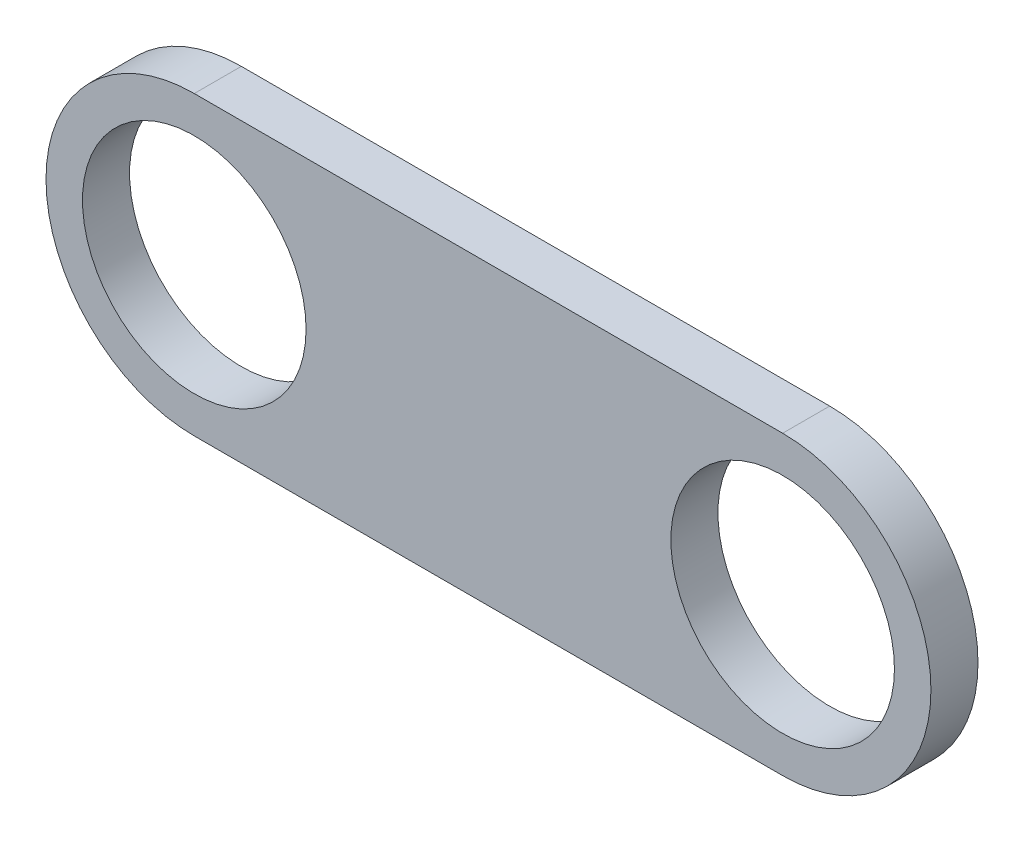
ISO-10303-21;
HEADER;
FILE_DESCRIPTION(('STEP AP214'),'2;1');
FILE_NAME('part.step','',(''),(''),'','','');
FILE_SCHEMA(('AUTOMOTIVE_DESIGN { 1 0 10303 214 1 1 1 1 }'));
ENDSEC;
DATA;
#1=APPLICATION_CONTEXT('core data for automotive mechanical design processes');
#2=APPLICATION_PROTOCOL_DEFINITION('international standard','automotive_design',2000,#1);
#3=PRODUCT_CONTEXT('',#1,'mechanical');
#4=PRODUCT('Part','Part','',(#3));
#5=PRODUCT_RELATED_PRODUCT_CATEGORY('part','',(#4));
#6=PRODUCT_DEFINITION_FORMATION('','',#4);
#7=PRODUCT_DEFINITION_CONTEXT('part definition',#1,'design');
#8=PRODUCT_DEFINITION('design','',#6,#7);
#9=PRODUCT_DEFINITION_SHAPE('','',#8);
#10=(LENGTH_UNIT() NAMED_UNIT(*) SI_UNIT(.MILLI.,.METRE.));
#11=(NAMED_UNIT(*) PLANE_ANGLE_UNIT() SI_UNIT($,.RADIAN.));
#12=(NAMED_UNIT(*) SI_UNIT($,.STERADIAN.) SOLID_ANGLE_UNIT());
#13=UNCERTAINTY_MEASURE_WITH_UNIT(LENGTH_MEASURE(1.E-05),#10,'distance_accuracy_value','');
#14=(GEOMETRIC_REPRESENTATION_CONTEXT(3) GLOBAL_UNCERTAINTY_ASSIGNED_CONTEXT((#13)) GLOBAL_UNIT_ASSIGNED_CONTEXT((#10,
#11,#12)) REPRESENTATION_CONTEXT('',''));
#15=CARTESIAN_POINT('',(0.,0.,0.));
#16=DIRECTION('',(0.,0.,1.));
#17=DIRECTION('',(1.,0.,0.));
#18=AXIS2_PLACEMENT_3D('',#15,#16,#17);
#19=CARTESIAN_POINT('',(0.,0.,4.));
#20=DIRECTION('',(0.,0.,1.));
#21=DIRECTION('',(1.,0.,0.));
#22=AXIS2_PLACEMENT_3D('',#19,#20,#21);
#23=PLANE('',#22);
#24=CARTESIAN_POINT('',(50.,0.,4.));
#25=DIRECTION('',(0.,0.,1.));
#26=DIRECTION('',(1.,0.,0.));
#27=AXIS2_PLACEMENT_3D('',#24,#25,#26);
#28=CIRCLE('',#27,9.5);
#29=CARTESIAN_POINT('',(59.5,0.,4.));
#30=VERTEX_POINT('',#29);
#31=EDGE_CURVE('E114',#30,#30,#28,.T.);
#32=ORIENTED_EDGE('',*,*,#31,.F.);
#33=EDGE_LOOP('',(#32));
#34=FACE_BOUND('',#33,.T.);
#35=CARTESIAN_POINT('',(0.,0.,4.));
#36=DIRECTION('',(0.,0.,1.));
#37=DIRECTION('',(1.,0.,0.));
#38=AXIS2_PLACEMENT_3D('',#35,#36,#37);
#39=CIRCLE('',#38,12.6);
#40=CARTESIAN_POINT('',(0.,12.6,4.));
#41=VERTEX_POINT('',#40);
#42=CARTESIAN_POINT('',(0.,-12.6,4.));
#43=VERTEX_POINT('',#42);
#44=EDGE_CURVE('E94',#41,#43,#39,.T.);
#45=ORIENTED_EDGE('',*,*,#44,.T.);
#46=DIRECTION('',(1.,0.,0.));
#47=VECTOR('',#46,1.);
#48=CARTESIAN_POINT('',(0.,-12.6,4.));
#49=LINE('',#48,#47);
#50=CARTESIAN_POINT('',(50.,-12.6,4.));
#51=VERTEX_POINT('',#50);
#52=EDGE_CURVE('E89',#43,#51,#49,.T.);
#53=ORIENTED_EDGE('',*,*,#52,.T.);
#54=CARTESIAN_POINT('',(50.,0.,4.));
#55=DIRECTION('',(0.,0.,1.));
#56=DIRECTION('',(1.,0.,0.));
#57=AXIS2_PLACEMENT_3D('',#54,#55,#56);
#58=CIRCLE('',#57,12.6);
#59=CARTESIAN_POINT('',(50.,12.6,4.));
#60=VERTEX_POINT('',#59);
#61=EDGE_CURVE('E92',#51,#60,#58,.T.);
#62=ORIENTED_EDGE('',*,*,#61,.T.);
#63=DIRECTION('',(-1.,0.,0.));
#64=VECTOR('',#63,1.);
#65=CARTESIAN_POINT('',(0.,12.6,4.));
#66=LINE('',#65,#64);
#67=EDGE_CURVE('E59',#60,#41,#66,.T.);
#68=ORIENTED_EDGE('',*,*,#67,.T.);
#69=EDGE_LOOP('',(#45,#53,#62,#68));
#70=FACE_BOUND('',#69,.T.);
#71=CARTESIAN_POINT('',(0.,0.,4.));
#72=DIRECTION('',(0.,0.,1.));
#73=DIRECTION('',(1.,0.,0.));
#74=AXIS2_PLACEMENT_3D('',#71,#72,#73);
#75=CIRCLE('',#74,9.5);
#76=CARTESIAN_POINT('',(9.5,0.,4.));
#77=VERTEX_POINT('',#76);
#78=EDGE_CURVE('E136',#77,#77,#75,.T.);
#79=ORIENTED_EDGE('',*,*,#78,.F.);
#80=EDGE_LOOP('',(#79));
#81=FACE_BOUND('',#80,.T.);
#82=ADVANCED_FACE('F41',(#34,#70,#81),#23,.T.);
#83=CARTESIAN_POINT('',(0.,0.,0.));
#84=DIRECTION('',(0.,0.,1.));
#85=DIRECTION('',(1.,0.,0.));
#86=AXIS2_PLACEMENT_3D('',#83,#84,#85);
#87=PLANE('',#86);
#88=CARTESIAN_POINT('',(0.,0.,0.));
#89=DIRECTION('',(0.,0.,1.));
#90=DIRECTION('',(1.,0.,0.));
#91=AXIS2_PLACEMENT_3D('',#88,#89,#90);
#92=CIRCLE('',#91,12.6);
#93=CARTESIAN_POINT('',(0.,12.6,0.));
#94=VERTEX_POINT('',#93);
#95=CARTESIAN_POINT('',(0.,-12.6,0.));
#96=VERTEX_POINT('',#95);
#97=EDGE_CURVE('E110',#94,#96,#92,.T.);
#98=ORIENTED_EDGE('',*,*,#97,.F.);
#99=DIRECTION('',(-1.,0.,0.));
#100=VECTOR('',#99,1.);
#101=CARTESIAN_POINT('',(0.,12.6,0.));
#102=LINE('',#101,#100);
#103=CARTESIAN_POINT('',(50.,12.6,0.));
#104=VERTEX_POINT('',#103);
#105=EDGE_CURVE('E82',#104,#94,#102,.T.);
#106=ORIENTED_EDGE('',*,*,#105,.F.);
#107=CARTESIAN_POINT('',(50.,0.,0.));
#108=DIRECTION('',(0.,0.,1.));
#109=DIRECTION('',(1.,0.,0.));
#110=AXIS2_PLACEMENT_3D('',#107,#108,#109);
#111=CIRCLE('',#110,12.6);
#112=CARTESIAN_POINT('',(50.,-12.6,0.));
#113=VERTEX_POINT('',#112);
#114=EDGE_CURVE('E76',#113,#104,#111,.T.);
#115=ORIENTED_EDGE('',*,*,#114,.F.);
#116=DIRECTION('',(1.,0.,0.));
#117=VECTOR('',#116,1.);
#118=CARTESIAN_POINT('',(0.,-12.6,0.));
#119=LINE('',#118,#117);
#120=EDGE_CURVE('E99',#96,#113,#119,.T.);
#121=ORIENTED_EDGE('',*,*,#120,.F.);
#122=EDGE_LOOP('',(#98,#106,#115,#121));
#123=FACE_BOUND('',#122,.T.);
#124=CARTESIAN_POINT('',(50.,0.,0.));
#125=DIRECTION('',(0.,0.,1.));
#126=DIRECTION('',(1.,0.,0.));
#127=AXIS2_PLACEMENT_3D('',#124,#125,#126);
#128=CIRCLE('',#127,9.5);
#129=CARTESIAN_POINT('',(59.5,0.,0.));
#130=VERTEX_POINT('',#129);
#131=EDGE_CURVE('E132',#130,#130,#128,.T.);
#132=ORIENTED_EDGE('',*,*,#131,.T.);
#133=EDGE_LOOP('',(#132));
#134=FACE_BOUND('',#133,.T.);
#135=CARTESIAN_POINT('',(0.,0.,0.));
#136=DIRECTION('',(0.,0.,1.));
#137=DIRECTION('',(1.,0.,0.));
#138=AXIS2_PLACEMENT_3D('',#135,#136,#137);
#139=CIRCLE('',#138,9.5);
#140=CARTESIAN_POINT('',(9.5,0.,0.));
#141=VERTEX_POINT('',#140);
#142=EDGE_CURVE('E140',#141,#141,#139,.T.);
#143=ORIENTED_EDGE('',*,*,#142,.T.);
#144=EDGE_LOOP('',(#143));
#145=FACE_BOUND('',#144,.T.);
#146=ADVANCED_FACE('F127',(#123,#134,#145),#87,.F.);
#147=CARTESIAN_POINT('',(0.,0.,4.));
#148=DIRECTION('',(0.,0.,-1.));
#149=DIRECTION('',(-1.,0.,0.));
#150=AXIS2_PLACEMENT_3D('',#147,#148,#149);
#151=CYLINDRICAL_SURFACE('',#150,12.6);
#152=ORIENTED_EDGE('',*,*,#97,.T.);
#153=DIRECTION('',(0.,0.,-1.));
#154=VECTOR('',#153,1.);
#155=CARTESIAN_POINT('',(0.,-12.6,4.));
#156=LINE('',#155,#154);
#157=EDGE_CURVE('E11',#43,#96,#156,.T.);
#158=ORIENTED_EDGE('',*,*,#157,.F.);
#159=ORIENTED_EDGE('',*,*,#44,.F.);
#160=DIRECTION('',(0.,0.,-1.));
#161=VECTOR('',#160,1.);
#162=CARTESIAN_POINT('',(0.,12.6,4.));
#163=LINE('',#162,#161);
#164=EDGE_CURVE('E106',#41,#94,#163,.T.);
#165=ORIENTED_EDGE('',*,*,#164,.T.);
#166=EDGE_LOOP('',(#152,#158,#159,#165));
#167=FACE_BOUND('',#166,.T.);
#168=ADVANCED_FACE('F43',(#167),#151,.T.);
#169=CARTESIAN_POINT('',(0.,-12.6,4.));
#170=DIRECTION('',(0.,1.,0.));
#171=DIRECTION('',(-1.,0.,0.));
#172=AXIS2_PLACEMENT_3D('',#169,#170,#171);
#173=PLANE('',#172);
#174=ORIENTED_EDGE('',*,*,#120,.T.);
#175=DIRECTION('',(0.,0.,-1.));
#176=VECTOR('',#175,1.);
#177=CARTESIAN_POINT('',(50.,-12.6,4.));
#178=LINE('',#177,#176);
#179=EDGE_CURVE('E51',#51,#113,#178,.T.);
#180=ORIENTED_EDGE('',*,*,#179,.F.);
#181=ORIENTED_EDGE('',*,*,#52,.F.);
#182=ORIENTED_EDGE('',*,*,#157,.T.);
#183=EDGE_LOOP('',(#174,#180,#181,#182));
#184=FACE_BOUND('',#183,.T.);
#185=ADVANCED_FACE('F98',(#184),#173,.F.);
#186=CARTESIAN_POINT('',(50.,0.,4.));
#187=DIRECTION('',(0.,0.,-1.));
#188=DIRECTION('',(-1.,0.,0.));
#189=AXIS2_PLACEMENT_3D('',#186,#187,#188);
#190=CYLINDRICAL_SURFACE('',#189,12.6);
#191=ORIENTED_EDGE('',*,*,#114,.T.);
#192=DIRECTION('',(0.,0.,-1.));
#193=VECTOR('',#192,1.);
#194=CARTESIAN_POINT('',(50.,12.6,4.));
#195=LINE('',#194,#193);
#196=EDGE_CURVE('E101',#60,#104,#195,.T.);
#197=ORIENTED_EDGE('',*,*,#196,.F.);
#198=ORIENTED_EDGE('',*,*,#61,.F.);
#199=ORIENTED_EDGE('',*,*,#179,.T.);
#200=EDGE_LOOP('',(#191,#197,#198,#199));
#201=FACE_BOUND('',#200,.T.);
#202=ADVANCED_FACE('F102',(#201),#190,.T.);
#203=CARTESIAN_POINT('',(0.,12.6,4.));
#204=DIRECTION('',(0.,-1.,0.));
#205=DIRECTION('',(1.,0.,0.));
#206=AXIS2_PLACEMENT_3D('',#203,#204,#205);
#207=PLANE('',#206);
#208=ORIENTED_EDGE('',*,*,#105,.T.);
#209=ORIENTED_EDGE('',*,*,#164,.F.);
#210=ORIENTED_EDGE('',*,*,#67,.F.);
#211=ORIENTED_EDGE('',*,*,#196,.T.);
#212=EDGE_LOOP('',(#208,#209,#210,#211));
#213=FACE_BOUND('',#212,.T.);
#214=ADVANCED_FACE('F124',(#213),#207,.F.);
#215=CARTESIAN_POINT('',(50.,0.,4.));
#216=DIRECTION('',(0.,0.,-1.));
#217=DIRECTION('',(-1.,0.,0.));
#218=AXIS2_PLACEMENT_3D('',#215,#216,#217);
#219=CYLINDRICAL_SURFACE('',#218,9.5);
#220=ORIENTED_EDGE('',*,*,#31,.T.);
#221=EDGE_LOOP('',(#220));
#222=FACE_BOUND('',#221,.T.);
#223=ORIENTED_EDGE('',*,*,#131,.F.);
#224=EDGE_LOOP('',(#223));
#225=FACE_BOUND('',#224,.T.);
#226=ADVANCED_FACE('F159',(#222,#225),#219,.F.);
#227=CARTESIAN_POINT('',(0.,0.,4.));
#228=DIRECTION('',(0.,0.,-1.));
#229=DIRECTION('',(-1.,0.,0.));
#230=AXIS2_PLACEMENT_3D('',#227,#228,#229);
#231=CYLINDRICAL_SURFACE('',#230,9.5);
#232=ORIENTED_EDGE('',*,*,#78,.T.);
#233=EDGE_LOOP('',(#232));
#234=FACE_BOUND('',#233,.T.);
#235=ORIENTED_EDGE('',*,*,#142,.F.);
#236=EDGE_LOOP('',(#235));
#237=FACE_BOUND('',#236,.T.);
#238=ADVANCED_FACE('F148',(#234,#237),#231,.F.);
#239=CLOSED_SHELL('',(#82,#146,#168,#185,#202,#214,#226,#238));
#240=MANIFOLD_SOLID_BREP('B2',#239);
#241=ADVANCED_BREP_SHAPE_REPRESENTATION('',(#18,#240),#14);
#242=SHAPE_DEFINITION_REPRESENTATION(#9,#241);
ENDSEC;
END-ISO-10303-21;
